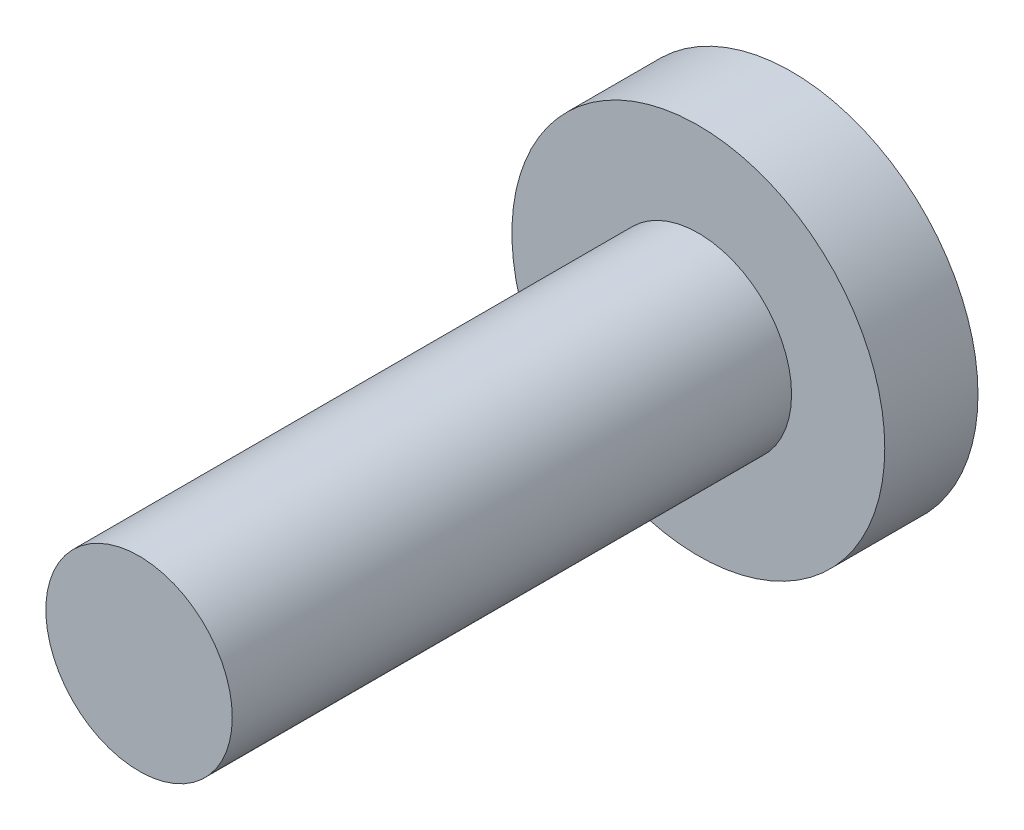
ISO-10303-21;
HEADER;
FILE_DESCRIPTION(('STEP AP214'),'2;1');
FILE_NAME('part.step','',(''),(''),'','','');
FILE_SCHEMA(('AUTOMOTIVE_DESIGN { 1 0 10303 214 1 1 1 1 }'));
ENDSEC;
DATA;
#1=APPLICATION_CONTEXT('core data for automotive mechanical design processes');
#2=APPLICATION_PROTOCOL_DEFINITION('international standard','automotive_design',2000,#1);
#3=PRODUCT_CONTEXT('',#1,'mechanical');
#4=PRODUCT('Part','Part','',(#3));
#5=PRODUCT_RELATED_PRODUCT_CATEGORY('part','',(#4));
#6=PRODUCT_DEFINITION_FORMATION('','',#4);
#7=PRODUCT_DEFINITION_CONTEXT('part definition',#1,'design');
#8=PRODUCT_DEFINITION('design','',#6,#7);
#9=PRODUCT_DEFINITION_SHAPE('','',#8);
#10=(LENGTH_UNIT() NAMED_UNIT(*) SI_UNIT(.MILLI.,.METRE.));
#11=(NAMED_UNIT(*) PLANE_ANGLE_UNIT() SI_UNIT($,.RADIAN.));
#12=(NAMED_UNIT(*) SI_UNIT($,.STERADIAN.) SOLID_ANGLE_UNIT());
#13=UNCERTAINTY_MEASURE_WITH_UNIT(LENGTH_MEASURE(1.E-05),#10,'distance_accuracy_value','');
#14=(GEOMETRIC_REPRESENTATION_CONTEXT(3) GLOBAL_UNCERTAINTY_ASSIGNED_CONTEXT((#13)) GLOBAL_UNIT_ASSIGNED_CONTEXT((#10,
#11,#12)) REPRESENTATION_CONTEXT('',''));
#15=CARTESIAN_POINT('',(0.,0.,0.));
#16=DIRECTION('',(0.,0.,1.));
#17=DIRECTION('',(1.,0.,0.));
#18=AXIS2_PLACEMENT_3D('',#15,#16,#17);
#19=CARTESIAN_POINT('',(0.,0.,5.));
#20=DIRECTION('',(0.,0.,-1.));
#21=DIRECTION('',(-1.,0.,0.));
#22=AXIS2_PLACEMENT_3D('',#19,#20,#21);
#23=CYLINDRICAL_SURFACE('',#22,10.);
#24=CARTESIAN_POINT('',(0.,0.,5.));
#25=DIRECTION('',(0.,0.,1.));
#26=DIRECTION('',(1.,0.,0.));
#27=AXIS2_PLACEMENT_3D('',#24,#25,#26);
#28=CIRCLE('',#27,10.);
#29=CARTESIAN_POINT('',(10.,0.,5.));
#30=VERTEX_POINT('',#29);
#31=EDGE_CURVE('E41',#30,#30,#28,.T.);
#32=ORIENTED_EDGE('',*,*,#31,.F.);
#33=EDGE_LOOP('',(#32));
#34=FACE_BOUND('',#33,.T.);
#35=CARTESIAN_POINT('',(0.,0.,0.));
#36=DIRECTION('',(0.,0.,1.));
#37=DIRECTION('',(1.,0.,0.));
#38=AXIS2_PLACEMENT_3D('',#35,#36,#37);
#39=CIRCLE('',#38,10.);
#40=CARTESIAN_POINT('',(10.,0.,0.));
#41=VERTEX_POINT('',#40);
#42=EDGE_CURVE('E37',#41,#41,#39,.T.);
#43=ORIENTED_EDGE('',*,*,#42,.T.);
#44=EDGE_LOOP('',(#43));
#45=FACE_BOUND('',#44,.T.);
#46=ADVANCED_FACE('F34',(#34,#45),#23,.T.);
#47=CARTESIAN_POINT('',(0.,0.,5.));
#48=DIRECTION('',(0.,0.,1.));
#49=DIRECTION('',(1.,0.,0.));
#50=AXIS2_PLACEMENT_3D('',#47,#48,#49);
#51=PLANE('',#50);
#52=CARTESIAN_POINT('',(0.,0.,5.));
#53=DIRECTION('',(0.,0.,1.));
#54=DIRECTION('',(1.,0.,0.));
#55=AXIS2_PLACEMENT_3D('',#52,#53,#54);
#56=CIRCLE('',#55,5.);
#57=CARTESIAN_POINT('',(5.,0.,5.));
#58=VERTEX_POINT('',#57);
#59=EDGE_CURVE('E10',#58,#58,#56,.T.);
#60=ORIENTED_EDGE('',*,*,#59,.F.);
#61=EDGE_LOOP('',(#60));
#62=FACE_BOUND('',#61,.T.);
#63=ORIENTED_EDGE('',*,*,#31,.T.);
#64=EDGE_LOOP('',(#63));
#65=FACE_BOUND('',#64,.T.);
#66=ADVANCED_FACE('F58',(#62,#65),#51,.T.);
#67=CARTESIAN_POINT('',(0.,0.,0.));
#68=DIRECTION('',(0.,0.,1.));
#69=DIRECTION('',(1.,0.,0.));
#70=AXIS2_PLACEMENT_3D('',#67,#68,#69);
#71=PLANE('',#70);
#72=ORIENTED_EDGE('',*,*,#42,.F.);
#73=EDGE_LOOP('',(#72));
#74=FACE_BOUND('',#73,.T.);
#75=ADVANCED_FACE('F55',(#74),#71,.F.);
#76=CARTESIAN_POINT('',(0.,0.,35.));
#77=DIRECTION('',(0.,0.,-1.));
#78=DIRECTION('',(-1.,0.,0.));
#79=AXIS2_PLACEMENT_3D('',#76,#77,#78);
#80=CYLINDRICAL_SURFACE('',#79,5.);
#81=CARTESIAN_POINT('',(0.,0.,35.));
#82=DIRECTION('',(0.,0.,1.));
#83=DIRECTION('',(1.,0.,0.));
#84=AXIS2_PLACEMENT_3D('',#81,#82,#83);
#85=CIRCLE('',#84,5.);
#86=CARTESIAN_POINT('',(5.,0.,35.));
#87=VERTEX_POINT('',#86);
#88=EDGE_CURVE('E47',#87,#87,#85,.T.);
#89=ORIENTED_EDGE('',*,*,#88,.F.);
#90=EDGE_LOOP('',(#89));
#91=FACE_BOUND('',#90,.T.);
#92=ORIENTED_EDGE('',*,*,#59,.T.);
#93=EDGE_LOOP('',(#92));
#94=FACE_BOUND('',#93,.T.);
#95=ADVANCED_FACE('F57',(#91,#94),#80,.T.);
#96=CARTESIAN_POINT('',(0.,0.,35.));
#97=DIRECTION('',(0.,0.,1.));
#98=DIRECTION('',(1.,0.,0.));
#99=AXIS2_PLACEMENT_3D('',#96,#97,#98);
#100=PLANE('',#99);
#101=ORIENTED_EDGE('',*,*,#88,.T.);
#102=EDGE_LOOP('',(#101));
#103=FACE_BOUND('',#102,.T.);
#104=ADVANCED_FACE('F63',(#103),#100,.T.);
#105=CLOSED_SHELL('',(#46,#66,#75,#95,#104));
#106=MANIFOLD_SOLID_BREP('B2',#105);
#107=ADVANCED_BREP_SHAPE_REPRESENTATION('',(#18,#106),#14);
#108=SHAPE_DEFINITION_REPRESENTATION(#9,#107);
ENDSEC;
END-ISO-10303-21;
